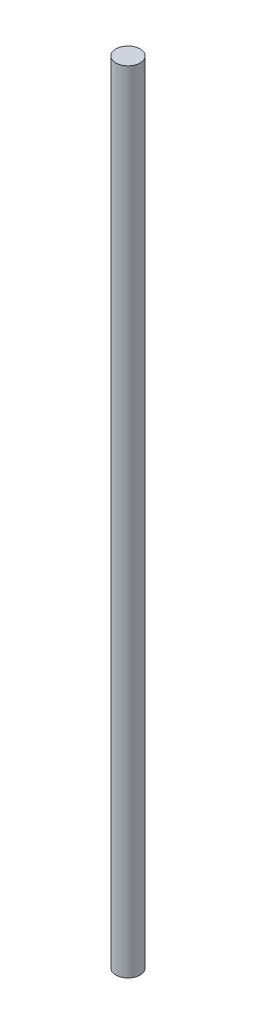
ISO-10303-21;
HEADER;
FILE_DESCRIPTION(('STEP AP214'),'2;1');
FILE_NAME('part.step','',(''),(''),'','','');
FILE_SCHEMA(('AUTOMOTIVE_DESIGN { 1 0 10303 214 1 1 1 1 }'));
ENDSEC;
DATA;
#1=APPLICATION_CONTEXT('core data for automotive mechanical design processes');
#2=APPLICATION_PROTOCOL_DEFINITION('international standard','automotive_design',2000,#1);
#3=PRODUCT_CONTEXT('',#1,'mechanical');
#4=PRODUCT('Part','Part','',(#3));
#5=PRODUCT_RELATED_PRODUCT_CATEGORY('part','',(#4));
#6=PRODUCT_DEFINITION_FORMATION('','',#4);
#7=PRODUCT_DEFINITION_CONTEXT('part definition',#1,'design');
#8=PRODUCT_DEFINITION('design','',#6,#7);
#9=PRODUCT_DEFINITION_SHAPE('','',#8);
#10=(LENGTH_UNIT() NAMED_UNIT(*) SI_UNIT(.MILLI.,.METRE.));
#11=(NAMED_UNIT(*) PLANE_ANGLE_UNIT() SI_UNIT($,.RADIAN.));
#12=(NAMED_UNIT(*) SI_UNIT($,.STERADIAN.) SOLID_ANGLE_UNIT());
#13=UNCERTAINTY_MEASURE_WITH_UNIT(LENGTH_MEASURE(1.E-05),#10,'distance_accuracy_value','');
#14=(GEOMETRIC_REPRESENTATION_CONTEXT(3) GLOBAL_UNCERTAINTY_ASSIGNED_CONTEXT((#13)) GLOBAL_UNIT_ASSIGNED_CONTEXT((#10,
#11,#12)) REPRESENTATION_CONTEXT('',''));
#15=CARTESIAN_POINT('',(0.,0.,0.));
#16=DIRECTION('',(0.,0.,1.));
#17=DIRECTION('',(1.,0.,0.));
#18=AXIS2_PLACEMENT_3D('',#15,#16,#17);
#19=CARTESIAN_POINT('',(0.,325.,0.));
#20=DIRECTION('',(0.,-1.,0.));
#21=DIRECTION('',(0.,0.,-1.));
#22=AXIS2_PLACEMENT_3D('',#19,#20,#21);
#23=CYLINDRICAL_SURFACE('',#22,5.);
#24=CARTESIAN_POINT('',(0.,325.,0.));
#25=DIRECTION('',(0.,1.,0.));
#26=DIRECTION('',(0.,0.,1.));
#27=AXIS2_PLACEMENT_3D('',#24,#25,#26);
#28=CIRCLE('',#27,5.);
#29=CARTESIAN_POINT('',(0.,325.,5.));
#30=VERTEX_POINT('',#29);
#31=EDGE_CURVE('E10',#30,#30,#28,.T.);
#32=ORIENTED_EDGE('',*,*,#31,.F.);
#33=EDGE_LOOP('',(#32));
#34=FACE_BOUND('',#33,.T.);
#35=CARTESIAN_POINT('',(0.,0.,0.));
#36=DIRECTION('',(0.,1.,0.));
#37=DIRECTION('',(0.,0.,1.));
#38=AXIS2_PLACEMENT_3D('',#35,#36,#37);
#39=CIRCLE('',#38,5.);
#40=CARTESIAN_POINT('',(0.,0.,5.));
#41=VERTEX_POINT('',#40);
#42=EDGE_CURVE('E40',#41,#41,#39,.T.);
#43=ORIENTED_EDGE('',*,*,#42,.T.);
#44=EDGE_LOOP('',(#43));
#45=FACE_BOUND('',#44,.T.);
#46=ADVANCED_FACE('F37',(#34,#45),#23,.T.);
#47=CARTESIAN_POINT('',(0.,325.,0.));
#48=DIRECTION('',(0.,1.,0.));
#49=DIRECTION('',(0.,0.,1.));
#50=AXIS2_PLACEMENT_3D('',#47,#48,#49);
#51=PLANE('',#50);
#52=ORIENTED_EDGE('',*,*,#31,.T.);
#53=EDGE_LOOP('',(#52));
#54=FACE_BOUND('',#53,.T.);
#55=ADVANCED_FACE('F54',(#54),#51,.T.);
#56=CARTESIAN_POINT('',(0.,0.,0.));
#57=DIRECTION('',(0.,1.,0.));
#58=DIRECTION('',(0.,0.,1.));
#59=AXIS2_PLACEMENT_3D('',#56,#57,#58);
#60=PLANE('',#59);
#61=ORIENTED_EDGE('',*,*,#42,.F.);
#62=EDGE_LOOP('',(#61));
#63=FACE_BOUND('',#62,.T.);
#64=ADVANCED_FACE('F52',(#63),#60,.F.);
#65=CLOSED_SHELL('',(#46,#55,#64));
#66=MANIFOLD_SOLID_BREP('B2',#65);
#67=ADVANCED_BREP_SHAPE_REPRESENTATION('',(#18,#66),#14);
#68=SHAPE_DEFINITION_REPRESENTATION(#9,#67);
ENDSEC;
END-ISO-10303-21;
